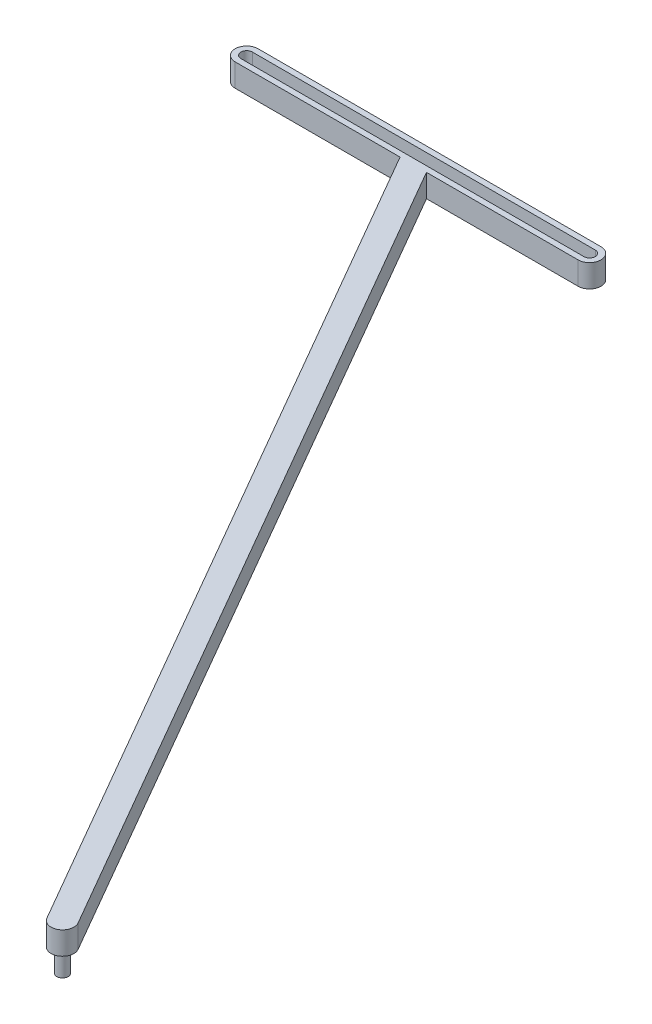
ISO-10303-21;
HEADER;
FILE_DESCRIPTION(('STEP AP214'),'2;1');
FILE_NAME('part.step','',(''),(''),'','','');
FILE_SCHEMA(('AUTOMOTIVE_DESIGN { 1 0 10303 214 1 1 1 1 }'));
ENDSEC;
DATA;
#1=APPLICATION_CONTEXT('core data for automotive mechanical design processes');
#2=APPLICATION_PROTOCOL_DEFINITION('international standard','automotive_design',2000,#1);
#3=PRODUCT_CONTEXT('',#1,'mechanical');
#4=PRODUCT('Part','Part','',(#3));
#5=PRODUCT_RELATED_PRODUCT_CATEGORY('part','',(#4));
#6=PRODUCT_DEFINITION_FORMATION('','',#4);
#7=PRODUCT_DEFINITION_CONTEXT('part definition',#1,'design');
#8=PRODUCT_DEFINITION('design','',#6,#7);
#9=PRODUCT_DEFINITION_SHAPE('','',#8);
#10=(LENGTH_UNIT() NAMED_UNIT(*) SI_UNIT(.MILLI.,.METRE.));
#11=(NAMED_UNIT(*) PLANE_ANGLE_UNIT() SI_UNIT($,.RADIAN.));
#12=(NAMED_UNIT(*) SI_UNIT($,.STERADIAN.) SOLID_ANGLE_UNIT());
#13=UNCERTAINTY_MEASURE_WITH_UNIT(LENGTH_MEASURE(1.E-05),#10,'distance_accuracy_value','');
#14=(GEOMETRIC_REPRESENTATION_CONTEXT(3) GLOBAL_UNCERTAINTY_ASSIGNED_CONTEXT((#13)) GLOBAL_UNIT_ASSIGNED_CONTEXT((#10,
#11,#12)) REPRESENTATION_CONTEXT('',''));
#15=CARTESIAN_POINT('',(0.,0.,0.));
#16=DIRECTION('',(0.,0.,1.));
#17=DIRECTION('',(1.,0.,0.));
#18=AXIS2_PLACEMENT_3D('',#15,#16,#17);
#19=CARTESIAN_POINT('',(0.,0.,67.4519052838332));
#20=DIRECTION('',(0.,0.,-1.));
#21=DIRECTION('',(-1.,0.,0.));
#22=AXIS2_PLACEMENT_3D('',#19,#20,#21);
#23=PLANE('',#22);
#24=DIRECTION('',(1.,0.,0.));
#25=VECTOR('',#24,1.);
#26=CARTESIAN_POINT('',(0.,-10.,67.4519052838332));
#27=LINE('',#26,#25);
#28=CARTESIAN_POINT('',(-37.5,-10.,67.4519052838332));
#29=VERTEX_POINT('',#28);
#30=CARTESIAN_POINT('',(112.5,-10.,67.4519052838332));
#31=VERTEX_POINT('',#30);
#32=EDGE_CURVE('E183',#29,#31,#27,.T.);
#33=ORIENTED_EDGE('',*,*,#32,.F.);
#34=DIRECTION('',(0.,-1.,0.));
#35=VECTOR('',#34,1.);
#36=CARTESIAN_POINT('',(-37.5,0.,67.4519052838332));
#37=LINE('',#36,#35);
#38=CARTESIAN_POINT('',(-37.5,0.,67.4519052838332));
#39=VERTEX_POINT('',#38);
#40=EDGE_CURVE('E44',#39,#29,#37,.T.);
#41=ORIENTED_EDGE('',*,*,#40,.F.);
#42=DIRECTION('',(1.,0.,0.));
#43=VECTOR('',#42,1.);
#44=CARTESIAN_POINT('',(0.,0.,67.4519052838332));
#45=LINE('',#44,#43);
#46=CARTESIAN_POINT('',(112.5,0.,67.4519052838332));
#47=VERTEX_POINT('',#46);
#48=EDGE_CURVE('E145',#39,#47,#45,.T.);
#49=ORIENTED_EDGE('',*,*,#48,.T.);
#50=DIRECTION('',(0.,-1.,0.));
#51=VECTOR('',#50,1.);
#52=CARTESIAN_POINT('',(112.5,0.,67.4519052838332));
#53=LINE('',#52,#51);
#54=EDGE_CURVE('E52',#47,#31,#53,.T.);
#55=ORIENTED_EDGE('',*,*,#54,.T.);
#56=EDGE_LOOP('',(#33,#41,#49,#55));
#57=FACE_BOUND('',#56,.T.);
#58=ADVANCED_FACE('F35',(#57),#23,.T.);
#59=CARTESIAN_POINT('',(-37.5,0.,64.9519052838332));
#60=DIRECTION('',(0.,-1.,0.));
#61=DIRECTION('',(0.,0.,-1.));
#62=AXIS2_PLACEMENT_3D('',#59,#60,#61);
#63=CYLINDRICAL_SURFACE('',#62,2.5);
#64=CARTESIAN_POINT('',(-37.5,-10.,64.9519052838332));
#65=DIRECTION('',(0.,1.,0.));
#66=DIRECTION('',(0.,0.,1.));
#67=AXIS2_PLACEMENT_3D('',#64,#65,#66);
#68=CIRCLE('',#67,2.5);
#69=CARTESIAN_POINT('',(-37.5,-10.,62.4519052838332));
#70=VERTEX_POINT('',#69);
#71=EDGE_CURVE('E150',#29,#70,#68,.F.);
#72=ORIENTED_EDGE('',*,*,#71,.T.);
#73=DIRECTION('',(0.,-1.,0.));
#74=VECTOR('',#73,1.);
#75=CARTESIAN_POINT('',(-37.5,0.,62.4519052838332));
#76=LINE('',#75,#74);
#77=CARTESIAN_POINT('',(-37.5,0.,62.4519052838332));
#78=VERTEX_POINT('',#77);
#79=EDGE_CURVE('E135',#78,#70,#76,.T.);
#80=ORIENTED_EDGE('',*,*,#79,.F.);
#81=CARTESIAN_POINT('',(-37.5,0.,64.9519052838332));
#82=DIRECTION('',(0.,1.,0.));
#83=DIRECTION('',(0.,0.,1.));
#84=AXIS2_PLACEMENT_3D('',#81,#82,#83);
#85=CIRCLE('',#84,2.5);
#86=EDGE_CURVE('E140',#39,#78,#85,.F.);
#87=ORIENTED_EDGE('',*,*,#86,.F.);
#88=ORIENTED_EDGE('',*,*,#40,.T.);
#89=EDGE_LOOP('',(#72,#80,#87,#88));
#90=FACE_BOUND('',#89,.T.);
#91=ADVANCED_FACE('F148',(#90),#63,.F.);
#92=CARTESIAN_POINT('',(0.,0.,62.4519052838332));
#93=DIRECTION('',(0.,0.,-1.));
#94=DIRECTION('',(-1.,0.,0.));
#95=AXIS2_PLACEMENT_3D('',#92,#93,#94);
#96=PLANE('',#95);
#97=DIRECTION('',(1.,0.,0.));
#98=VECTOR('',#97,1.);
#99=CARTESIAN_POINT('',(0.,-10.,62.4519052838332));
#100=LINE('',#99,#98);
#101=CARTESIAN_POINT('',(112.5,-10.,62.4519052838332));
#102=VERTEX_POINT('',#101);
#103=EDGE_CURVE('E180',#70,#102,#100,.T.);
#104=ORIENTED_EDGE('',*,*,#103,.T.);
#105=DIRECTION('',(0.,-1.,0.));
#106=VECTOR('',#105,1.);
#107=CARTESIAN_POINT('',(112.5,0.,62.4519052838332));
#108=LINE('',#107,#106);
#109=CARTESIAN_POINT('',(112.5,0.,62.4519052838332));
#110=VERTEX_POINT('',#109);
#111=EDGE_CURVE('E91',#110,#102,#108,.T.);
#112=ORIENTED_EDGE('',*,*,#111,.F.);
#113=DIRECTION('',(1.,0.,0.));
#114=VECTOR('',#113,1.);
#115=CARTESIAN_POINT('',(0.,0.,62.4519052838332));
#116=LINE('',#115,#114);
#117=EDGE_CURVE('E131',#78,#110,#116,.T.);
#118=ORIENTED_EDGE('',*,*,#117,.F.);
#119=ORIENTED_EDGE('',*,*,#79,.T.);
#120=EDGE_LOOP('',(#104,#112,#118,#119));
#121=FACE_BOUND('',#120,.T.);
#122=ADVANCED_FACE('F133',(#121),#96,.F.);
#123=CARTESIAN_POINT('',(112.5,0.,64.9519052838332));
#124=DIRECTION('',(0.,-1.,0.));
#125=DIRECTION('',(0.,0.,-1.));
#126=AXIS2_PLACEMENT_3D('',#123,#124,#125);
#127=CYLINDRICAL_SURFACE('',#126,5.);
#128=CARTESIAN_POINT('',(112.5,-10.,64.9519052838332));
#129=DIRECTION('',(0.,1.,0.));
#130=DIRECTION('',(0.,0.,1.));
#131=AXIS2_PLACEMENT_3D('',#128,#129,#130);
#132=CIRCLE('',#131,5.);
#133=CARTESIAN_POINT('',(112.5,-10.,69.9519052838332));
#134=VERTEX_POINT('',#133);
#135=CARTESIAN_POINT('',(112.5,-10.,59.9519052838332));
#136=VERTEX_POINT('',#135);
#137=EDGE_CURVE('E204',#134,#136,#132,.T.);
#138=ORIENTED_EDGE('',*,*,#137,.T.);
#139=DIRECTION('',(0.,-1.,0.));
#140=VECTOR('',#139,1.);
#141=CARTESIAN_POINT('',(112.5,0.,59.9519052838332));
#142=LINE('',#141,#140);
#143=CARTESIAN_POINT('',(112.5,0.,59.9519052838332));
#144=VERTEX_POINT('',#143);
#145=EDGE_CURVE('E171',#144,#136,#142,.T.);
#146=ORIENTED_EDGE('',*,*,#145,.F.);
#147=CARTESIAN_POINT('',(112.5,0.,64.9519052838332));
#148=DIRECTION('',(0.,1.,0.));
#149=DIRECTION('',(0.,0.,1.));
#150=AXIS2_PLACEMENT_3D('',#147,#148,#149);
#151=CIRCLE('',#150,5.);
#152=CARTESIAN_POINT('',(112.5,0.,69.9519052838332));
#153=VERTEX_POINT('',#152);
#154=EDGE_CURVE('E104',#153,#144,#151,.T.);
#155=ORIENTED_EDGE('',*,*,#154,.F.);
#156=DIRECTION('',(0.,-1.,0.));
#157=VECTOR('',#156,1.);
#158=CARTESIAN_POINT('',(112.5,0.,69.9519052838332));
#159=LINE('',#158,#157);
#160=EDGE_CURVE('E156',#153,#134,#159,.T.);
#161=ORIENTED_EDGE('',*,*,#160,.T.);
#162=EDGE_LOOP('',(#138,#146,#155,#161));
#163=FACE_BOUND('',#162,.T.);
#164=ADVANCED_FACE('F37',(#163),#127,.T.);
#165=CARTESIAN_POINT('',(0.,0.,59.9519052838332));
#166=DIRECTION('',(0.,0.,-1.));
#167=DIRECTION('',(-1.,0.,0.));
#168=AXIS2_PLACEMENT_3D('',#165,#166,#167);
#169=PLANE('',#168);
#170=DIRECTION('',(1.,0.,0.));
#171=VECTOR('',#170,1.);
#172=CARTESIAN_POINT('',(0.,-10.,59.9519052838332));
#173=LINE('',#172,#171);
#174=CARTESIAN_POINT('',(-37.5,-10.,59.9519052838332));
#175=VERTEX_POINT('',#174);
#176=EDGE_CURVE('E201',#175,#136,#173,.T.);
#177=ORIENTED_EDGE('',*,*,#176,.F.);
#178=DIRECTION('',(0.,-1.,0.));
#179=VECTOR('',#178,1.);
#180=CARTESIAN_POINT('',(-37.5,0.,59.9519052838332));
#181=LINE('',#180,#179);
#182=CARTESIAN_POINT('',(-37.5,0.,59.9519052838332));
#183=VERTEX_POINT('',#182);
#184=EDGE_CURVE('E170',#183,#175,#181,.T.);
#185=ORIENTED_EDGE('',*,*,#184,.F.);
#186=DIRECTION('',(1.,0.,0.));
#187=VECTOR('',#186,1.);
#188=CARTESIAN_POINT('',(0.,0.,59.9519052838332));
#189=LINE('',#188,#187);
#190=EDGE_CURVE('E224',#183,#144,#189,.T.);
#191=ORIENTED_EDGE('',*,*,#190,.T.);
#192=ORIENTED_EDGE('',*,*,#145,.T.);
#193=EDGE_LOOP('',(#177,#185,#191,#192));
#194=FACE_BOUND('',#193,.T.);
#195=ADVANCED_FACE('F282',(#194),#169,.T.);
#196=CARTESIAN_POINT('',(-37.5,0.,64.9519052838332));
#197=DIRECTION('',(0.,-1.,0.));
#198=DIRECTION('',(0.,0.,-1.));
#199=AXIS2_PLACEMENT_3D('',#196,#197,#198);
#200=CYLINDRICAL_SURFACE('',#199,5.);
#201=CARTESIAN_POINT('',(-37.5,-10.,64.9519052838332));
#202=DIRECTION('',(0.,1.,0.));
#203=DIRECTION('',(0.,0.,1.));
#204=AXIS2_PLACEMENT_3D('',#201,#202,#203);
#205=CIRCLE('',#204,5.);
#206=CARTESIAN_POINT('',(-37.5,-10.,69.9519052838332));
#207=VERTEX_POINT('',#206);
#208=EDGE_CURVE('E198',#207,#175,#205,.F.);
#209=ORIENTED_EDGE('',*,*,#208,.F.);
#210=DIRECTION('',(0.,-1.,0.));
#211=VECTOR('',#210,1.);
#212=CARTESIAN_POINT('',(-37.5,0.,69.9519052838332));
#213=LINE('',#212,#211);
#214=CARTESIAN_POINT('',(-37.5,0.,69.9519052838332));
#215=VERTEX_POINT('',#214);
#216=EDGE_CURVE('E168',#215,#207,#213,.T.);
#217=ORIENTED_EDGE('',*,*,#216,.F.);
#218=CARTESIAN_POINT('',(-37.5,0.,64.9519052838332));
#219=DIRECTION('',(0.,1.,0.));
#220=DIRECTION('',(0.,0.,1.));
#221=AXIS2_PLACEMENT_3D('',#218,#219,#220);
#222=CIRCLE('',#221,5.);
#223=EDGE_CURVE('E221',#215,#183,#222,.F.);
#224=ORIENTED_EDGE('',*,*,#223,.T.);
#225=ORIENTED_EDGE('',*,*,#184,.T.);
#226=EDGE_LOOP('',(#209,#217,#224,#225));
#227=FACE_BOUND('',#226,.T.);
#228=ADVANCED_FACE('F279',(#227),#200,.T.);
#229=CARTESIAN_POINT('',(0.,0.,69.9519052838332));
#230=DIRECTION('',(0.,0.,-1.));
#231=DIRECTION('',(-1.,0.,0.));
#232=AXIS2_PLACEMENT_3D('',#229,#230,#231);
#233=PLANE('',#232);
#234=DIRECTION('',(1.,0.,0.));
#235=VECTOR('',#234,1.);
#236=CARTESIAN_POINT('',(0.,-10.,69.9519052838332));
#237=LINE('',#236,#235);
#238=CARTESIAN_POINT('',(34.613248654052,-10.,69.9519052838332));
#239=VERTEX_POINT('',#238);
#240=EDGE_CURVE('E195',#207,#239,#237,.T.);
#241=ORIENTED_EDGE('',*,*,#240,.T.);
#242=DIRECTION('',(0.,-1.,0.));
#243=VECTOR('',#242,1.);
#244=CARTESIAN_POINT('',(34.613248654052,0.,69.9519052838332));
#245=LINE('',#244,#243);
#246=CARTESIAN_POINT('',(34.613248654052,0.,69.9519052838332));
#247=VERTEX_POINT('',#246);
#248=EDGE_CURVE('E166',#247,#239,#245,.T.);
#249=ORIENTED_EDGE('',*,*,#248,.F.);
#250=DIRECTION('',(1.,0.,0.));
#251=VECTOR('',#250,1.);
#252=CARTESIAN_POINT('',(0.,0.,69.9519052838332));
#253=LINE('',#252,#251);
#254=EDGE_CURVE('E219',#215,#247,#253,.T.);
#255=ORIENTED_EDGE('',*,*,#254,.F.);
#256=ORIENTED_EDGE('',*,*,#216,.T.);
#257=EDGE_LOOP('',(#241,#249,#255,#256));
#258=FACE_BOUND('',#257,.T.);
#259=ADVANCED_FACE('F275',(#258),#233,.F.);
#260=CARTESIAN_POINT('',(-4.33012701892222,0.,2.50000000000002));
#261=DIRECTION('',(-0.866025403784439,0.,0.5));
#262=DIRECTION('',(0.5,0.,0.866025403784439));
#263=AXIS2_PLACEMENT_3D('',#260,#261,#262);
#264=PLANE('',#263);
#265=DIRECTION('',(-0.5,0.,-0.866025403784439));
#266=VECTOR('',#265,1.);
#267=CARTESIAN_POINT('',(-4.33012701892222,-10.,2.50000000000002));
#268=LINE('',#267,#266);
#269=CARTESIAN_POINT('',(245.669872981078,-10.,435.51270189222));
#270=VERTEX_POINT('',#269);
#271=EDGE_CURVE('E192',#270,#239,#268,.T.);
#272=ORIENTED_EDGE('',*,*,#271,.F.);
#273=DIRECTION('',(0.,-1.,0.));
#274=VECTOR('',#273,1.);
#275=CARTESIAN_POINT('',(245.669872981078,0.,435.51270189222));
#276=LINE('',#275,#274);
#277=CARTESIAN_POINT('',(245.669872981078,0.,435.51270189222));
#278=VERTEX_POINT('',#277);
#279=EDGE_CURVE('E164',#278,#270,#276,.T.);
#280=ORIENTED_EDGE('',*,*,#279,.F.);
#281=DIRECTION('',(-0.5,0.,-0.866025403784439));
#282=VECTOR('',#281,1.);
#283=CARTESIAN_POINT('',(-4.33012701892222,0.,2.50000000000002));
#284=LINE('',#283,#282);
#285=EDGE_CURVE('E216',#278,#247,#284,.T.);
#286=ORIENTED_EDGE('',*,*,#285,.T.);
#287=ORIENTED_EDGE('',*,*,#248,.T.);
#288=EDGE_LOOP('',(#272,#280,#286,#287));
#289=FACE_BOUND('',#288,.T.);
#290=ADVANCED_FACE('F271',(#289),#264,.T.);
#291=CARTESIAN_POINT('',(250.,0.,433.01270189222));
#292=DIRECTION('',(0.,-1.,0.));
#293=DIRECTION('',(0.,0.,-1.));
#294=AXIS2_PLACEMENT_3D('',#291,#292,#293);
#295=CYLINDRICAL_SURFACE('',#294,5.00000000000001);
#296=CARTESIAN_POINT('',(250.,-10.,433.01270189222));
#297=DIRECTION('',(0.,1.,0.));
#298=DIRECTION('',(0.,0.,1.));
#299=AXIS2_PLACEMENT_3D('',#296,#297,#298);
#300=CIRCLE('',#299,5.00000000000001);
#301=CARTESIAN_POINT('',(254.330127018922,-10.,430.51270189222));
#302=VERTEX_POINT('',#301);
#303=EDGE_CURVE('E189',#302,#270,#300,.F.);
#304=ORIENTED_EDGE('',*,*,#303,.F.);
#305=DIRECTION('',(0.,-1.,0.));
#306=VECTOR('',#305,1.);
#307=CARTESIAN_POINT('',(254.330127018922,0.,430.51270189222));
#308=LINE('',#307,#306);
#309=CARTESIAN_POINT('',(254.330127018922,0.,430.51270189222));
#310=VERTEX_POINT('',#309);
#311=EDGE_CURVE('E162',#310,#302,#308,.T.);
#312=ORIENTED_EDGE('',*,*,#311,.F.);
#313=CARTESIAN_POINT('',(250.,0.,433.01270189222));
#314=DIRECTION('',(0.,1.,0.));
#315=DIRECTION('',(0.,0.,1.));
#316=AXIS2_PLACEMENT_3D('',#313,#314,#315);
#317=CIRCLE('',#316,5.00000000000001);
#318=EDGE_CURVE('E213',#310,#278,#317,.F.);
#319=ORIENTED_EDGE('',*,*,#318,.T.);
#320=ORIENTED_EDGE('',*,*,#279,.T.);
#321=EDGE_LOOP('',(#304,#312,#319,#320));
#322=FACE_BOUND('',#321,.T.);
#323=ADVANCED_FACE('F267',(#322),#295,.T.);
#324=CARTESIAN_POINT('',(4.33012701892212,0.,-2.49999999999996));
#325=DIRECTION('',(-0.866025403784439,0.,0.5));
#326=DIRECTION('',(0.5,0.,0.866025403784439));
#327=AXIS2_PLACEMENT_3D('',#324,#325,#326);
#328=PLANE('',#327);
#329=DIRECTION('',(-0.5,0.,-0.866025403784439));
#330=VECTOR('',#329,1.);
#331=CARTESIAN_POINT('',(4.33012701892212,-10.,-2.49999999999996));
#332=LINE('',#331,#330);
#333=CARTESIAN_POINT('',(46.1602540378445,-10.,69.9519052838332));
#334=VERTEX_POINT('',#333);
#335=EDGE_CURVE('E187',#302,#334,#332,.T.);
#336=ORIENTED_EDGE('',*,*,#335,.T.);
#337=DIRECTION('',(0.,-1.,0.));
#338=VECTOR('',#337,1.);
#339=CARTESIAN_POINT('',(46.1602540378445,0.,69.9519052838332));
#340=LINE('',#339,#338);
#341=CARTESIAN_POINT('',(46.1602540378445,0.,69.9519052838332));
#342=VERTEX_POINT('',#341);
#343=EDGE_CURVE('E159',#342,#334,#340,.T.);
#344=ORIENTED_EDGE('',*,*,#343,.F.);
#345=DIRECTION('',(-0.5,0.,-0.866025403784439));
#346=VECTOR('',#345,1.);
#347=CARTESIAN_POINT('',(4.33012701892212,0.,-2.49999999999996));
#348=LINE('',#347,#346);
#349=EDGE_CURVE('E211',#310,#342,#348,.T.);
#350=ORIENTED_EDGE('',*,*,#349,.F.);
#351=ORIENTED_EDGE('',*,*,#311,.T.);
#352=EDGE_LOOP('',(#336,#344,#350,#351));
#353=FACE_BOUND('',#352,.T.);
#354=ADVANCED_FACE('F254',(#353),#328,.F.);
#355=CARTESIAN_POINT('',(0.,0.,69.9519052838332));
#356=DIRECTION('',(0.,0.,-1.));
#357=DIRECTION('',(-1.,0.,0.));
#358=AXIS2_PLACEMENT_3D('',#355,#356,#357);
#359=PLANE('',#358);
#360=DIRECTION('',(1.,0.,0.));
#361=VECTOR('',#360,1.);
#362=CARTESIAN_POINT('',(0.,-10.,69.9519052838332));
#363=LINE('',#362,#361);
#364=EDGE_CURVE('E185',#334,#134,#363,.T.);
#365=ORIENTED_EDGE('',*,*,#364,.T.);
#366=ORIENTED_EDGE('',*,*,#160,.F.);
#367=DIRECTION('',(1.,0.,0.));
#368=VECTOR('',#367,1.);
#369=CARTESIAN_POINT('',(0.,0.,69.9519052838332));
#370=LINE('',#369,#368);
#371=EDGE_CURVE('E209',#342,#153,#370,.T.);
#372=ORIENTED_EDGE('',*,*,#371,.F.);
#373=ORIENTED_EDGE('',*,*,#343,.T.);
#374=EDGE_LOOP('',(#365,#366,#372,#373));
#375=FACE_BOUND('',#374,.T.);
#376=ADVANCED_FACE('F247',(#375),#359,.F.);
#377=CARTESIAN_POINT('',(112.5,0.,64.9519052838332));
#378=DIRECTION('',(0.,-1.,0.));
#379=DIRECTION('',(0.,0.,-1.));
#380=AXIS2_PLACEMENT_3D('',#377,#378,#379);
#381=CYLINDRICAL_SURFACE('',#380,2.5);
#382=CARTESIAN_POINT('',(112.5,-10.,64.9519052838332));
#383=DIRECTION('',(0.,1.,0.));
#384=DIRECTION('',(0.,0.,1.));
#385=AXIS2_PLACEMENT_3D('',#382,#383,#384);
#386=CIRCLE('',#385,2.5);
#387=EDGE_CURVE('E177',#31,#102,#386,.T.);
#388=ORIENTED_EDGE('',*,*,#387,.F.);
#389=ORIENTED_EDGE('',*,*,#54,.F.);
#390=CARTESIAN_POINT('',(112.5,0.,64.9519052838332));
#391=DIRECTION('',(0.,1.,0.));
#392=DIRECTION('',(0.,0.,1.));
#393=AXIS2_PLACEMENT_3D('',#390,#391,#392);
#394=CIRCLE('',#393,2.5);
#395=EDGE_CURVE('E139',#47,#110,#394,.T.);
#396=ORIENTED_EDGE('',*,*,#395,.T.);
#397=ORIENTED_EDGE('',*,*,#111,.T.);
#398=EDGE_LOOP('',(#388,#389,#396,#397));
#399=FACE_BOUND('',#398,.T.);
#400=ADVANCED_FACE('F245',(#399),#381,.F.);
#401=CARTESIAN_POINT('',(0.,0.,0.));
#402=DIRECTION('',(0.,1.,0.));
#403=DIRECTION('',(0.,0.,1.));
#404=AXIS2_PLACEMENT_3D('',#401,#402,#403);
#405=PLANE('',#404);
#406=ORIENTED_EDGE('',*,*,#154,.T.);
#407=ORIENTED_EDGE('',*,*,#190,.F.);
#408=ORIENTED_EDGE('',*,*,#223,.F.);
#409=ORIENTED_EDGE('',*,*,#254,.T.);
#410=ORIENTED_EDGE('',*,*,#285,.F.);
#411=ORIENTED_EDGE('',*,*,#318,.F.);
#412=ORIENTED_EDGE('',*,*,#349,.T.);
#413=ORIENTED_EDGE('',*,*,#371,.T.);
#414=EDGE_LOOP('',(#406,#407,#408,#409,#410,#411,#412,#413));
#415=FACE_BOUND('',#414,.T.);
#416=ORIENTED_EDGE('',*,*,#48,.F.);
#417=ORIENTED_EDGE('',*,*,#86,.T.);
#418=ORIENTED_EDGE('',*,*,#117,.T.);
#419=ORIENTED_EDGE('',*,*,#395,.F.);
#420=EDGE_LOOP('',(#416,#417,#418,#419));
#421=FACE_BOUND('',#420,.T.);
#422=ADVANCED_FACE('F144',(#415,#421),#405,.T.);
#423=CARTESIAN_POINT('',(0.,-10.,0.));
#424=DIRECTION('',(0.,1.,0.));
#425=DIRECTION('',(0.,0.,1.));
#426=AXIS2_PLACEMENT_3D('',#423,#424,#425);
#427=PLANE('',#426);
#428=CARTESIAN_POINT('',(250.,-10.,433.01270189222));
#429=DIRECTION('',(0.,1.,0.));
#430=DIRECTION('',(0.,0.,1.));
#431=AXIS2_PLACEMENT_3D('',#428,#429,#430);
#432=CIRCLE('',#431,2.5);
#433=CARTESIAN_POINT('',(250.,-10.,435.51270189222));
#434=VERTEX_POINT('',#433);
#435=EDGE_CURVE('E11',#434,#434,#432,.F.);
#436=ORIENTED_EDGE('',*,*,#435,.F.);
#437=EDGE_LOOP('',(#436));
#438=FACE_BOUND('',#437,.T.);
#439=ORIENTED_EDGE('',*,*,#137,.F.);
#440=ORIENTED_EDGE('',*,*,#364,.F.);
#441=ORIENTED_EDGE('',*,*,#335,.F.);
#442=ORIENTED_EDGE('',*,*,#303,.T.);
#443=ORIENTED_EDGE('',*,*,#271,.T.);
#444=ORIENTED_EDGE('',*,*,#240,.F.);
#445=ORIENTED_EDGE('',*,*,#208,.T.);
#446=ORIENTED_EDGE('',*,*,#176,.T.);
#447=EDGE_LOOP('',(#439,#440,#441,#442,#443,#444,#445,#446));
#448=FACE_BOUND('',#447,.T.);
#449=ORIENTED_EDGE('',*,*,#32,.T.);
#450=ORIENTED_EDGE('',*,*,#387,.T.);
#451=ORIENTED_EDGE('',*,*,#103,.F.);
#452=ORIENTED_EDGE('',*,*,#71,.F.);
#453=EDGE_LOOP('',(#449,#450,#451,#452));
#454=FACE_BOUND('',#453,.T.);
#455=ADVANCED_FACE('F235',(#438,#448,#454),#427,.F.);
#456=CARTESIAN_POINT('',(250.,-20.,433.01270189222));
#457=DIRECTION('',(0.,1.,0.));
#458=DIRECTION('',(0.,0.,1.));
#459=AXIS2_PLACEMENT_3D('',#456,#457,#458);
#460=CYLINDRICAL_SURFACE('',#459,2.5);
#461=CARTESIAN_POINT('',(250.,-20.,433.01270189222));
#462=DIRECTION('',(0.,1.,0.));
#463=DIRECTION('',(0.,0.,1.));
#464=AXIS2_PLACEMENT_3D('',#461,#462,#463);
#465=CIRCLE('',#464,2.5);
#466=CARTESIAN_POINT('',(250.,-20.,435.51270189222));
#467=VERTEX_POINT('',#466);
#468=EDGE_CURVE('E206',#467,#467,#465,.F.);
#469=ORIENTED_EDGE('',*,*,#468,.F.);
#470=EDGE_LOOP('',(#469));
#471=FACE_BOUND('',#470,.T.);
#472=ORIENTED_EDGE('',*,*,#435,.T.);
#473=EDGE_LOOP('',(#472));
#474=FACE_BOUND('',#473,.T.);
#475=ADVANCED_FACE('F232',(#471,#474),#460,.T.);
#476=CARTESIAN_POINT('',(0.,-20.,0.));
#477=DIRECTION('',(0.,1.,0.));
#478=DIRECTION('',(0.,0.,1.));
#479=AXIS2_PLACEMENT_3D('',#476,#477,#478);
#480=PLANE('',#479);
#481=ORIENTED_EDGE('',*,*,#468,.T.);
#482=EDGE_LOOP('',(#481));
#483=FACE_BOUND('',#482,.T.);
#484=ADVANCED_FACE('F230',(#483),#480,.F.);
#485=CLOSED_SHELL('',(#58,#91,#122,#164,#195,#228,#259,#290,#323,#354,#376,#400,#422,#455,#475,#484));
#486=MANIFOLD_SOLID_BREP('B2',#485);
#487=ADVANCED_BREP_SHAPE_REPRESENTATION('',(#18,#486),#14);
#488=SHAPE_DEFINITION_REPRESENTATION(#9,#487);
ENDSEC;
END-ISO-10303-21;
